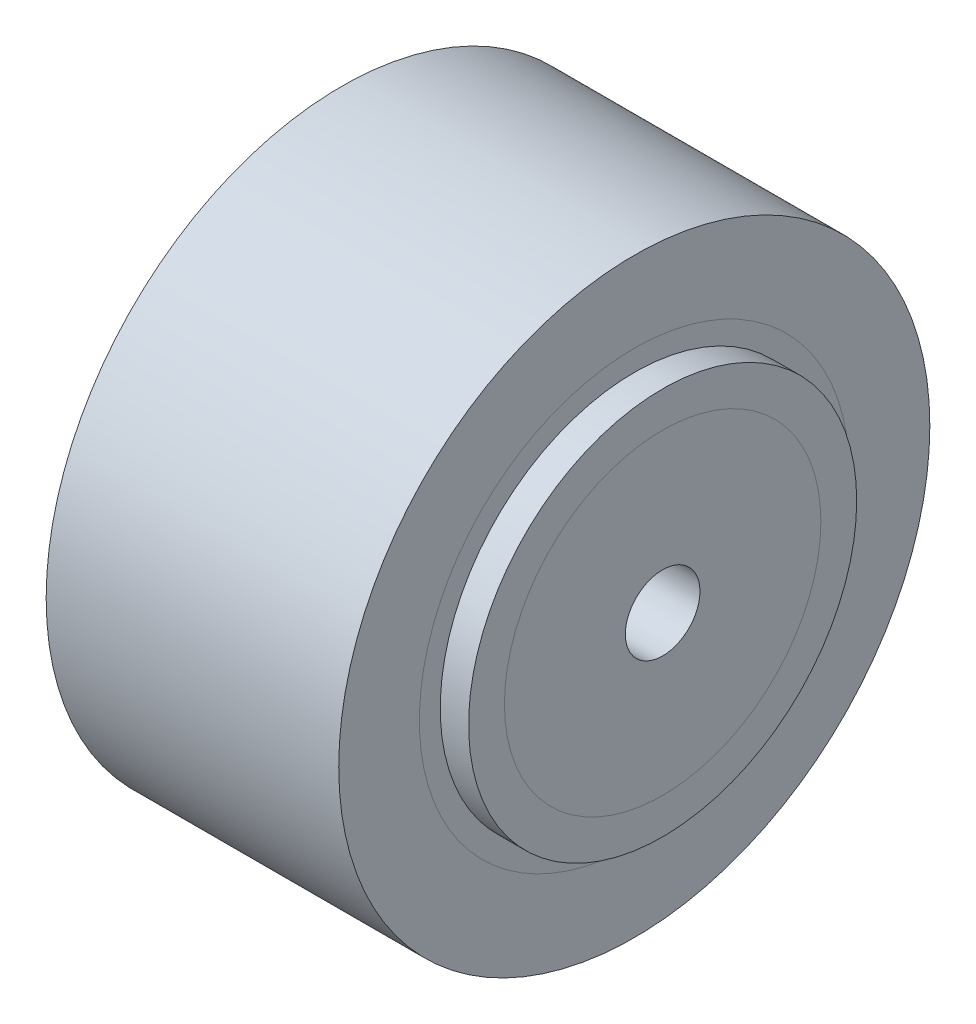
ISO-10303-21;
HEADER;
FILE_DESCRIPTION(('STEP AP214'),'2;1');
FILE_NAME('part.step','',(''),(''),'','','');
FILE_SCHEMA(('AUTOMOTIVE_DESIGN { 1 0 10303 214 1 1 1 1 }'));
ENDSEC;
DATA;
#1=APPLICATION_CONTEXT('core data for automotive mechanical design processes');
#2=APPLICATION_PROTOCOL_DEFINITION('international standard','automotive_design',2000,#1);
#3=PRODUCT_CONTEXT('',#1,'mechanical');
#4=PRODUCT('Part','Part','',(#3));
#5=PRODUCT_RELATED_PRODUCT_CATEGORY('part','',(#4));
#6=PRODUCT_DEFINITION_FORMATION('','',#4);
#7=PRODUCT_DEFINITION_CONTEXT('part definition',#1,'design');
#8=PRODUCT_DEFINITION('design','',#6,#7);
#9=PRODUCT_DEFINITION_SHAPE('','',#8);
#10=(LENGTH_UNIT() NAMED_UNIT(*) SI_UNIT(.MILLI.,.METRE.));
#11=(NAMED_UNIT(*) PLANE_ANGLE_UNIT() SI_UNIT($,.RADIAN.));
#12=(NAMED_UNIT(*) SI_UNIT($,.STERADIAN.) SOLID_ANGLE_UNIT());
#13=UNCERTAINTY_MEASURE_WITH_UNIT(LENGTH_MEASURE(1.E-05),#10,'distance_accuracy_value','');
#14=(GEOMETRIC_REPRESENTATION_CONTEXT(3) GLOBAL_UNCERTAINTY_ASSIGNED_CONTEXT((#13)) GLOBAL_UNIT_ASSIGNED_CONTEXT((#10,
#11,#12)) REPRESENTATION_CONTEXT('',''));
#15=CARTESIAN_POINT('',(0.,0.,0.));
#16=DIRECTION('',(0.,0.,1.));
#17=DIRECTION('',(1.,0.,0.));
#18=AXIS2_PLACEMENT_3D('',#15,#16,#17);
#19=CARTESIAN_POINT('',(-11.7,0.,0.));
#20=DIRECTION('',(1.,0.,0.));
#21=DIRECTION('',(0.,0.,-1.));
#22=AXIS2_PLACEMENT_3D('',#19,#20,#21);
#23=CYLINDRICAL_SURFACE('',#22,10.6);
#24=CARTESIAN_POINT('',(-11.7,0.,0.));
#25=DIRECTION('',(-1.,0.,0.));
#26=DIRECTION('',(0.,0.,1.));
#27=AXIS2_PLACEMENT_3D('',#24,#25,#26);
#28=CIRCLE('',#27,10.6);
#29=CARTESIAN_POINT('',(-11.7,0.,10.6));
#30=VERTEX_POINT('',#29);
#31=EDGE_CURVE('E53',#30,#30,#28,.T.);
#32=ORIENTED_EDGE('',*,*,#31,.F.);
#33=EDGE_LOOP('',(#32));
#34=FACE_BOUND('',#33,.T.);
#35=CARTESIAN_POINT('',(0.,0.,0.));
#36=DIRECTION('',(-1.,0.,0.));
#37=DIRECTION('',(0.,0.,1.));
#38=AXIS2_PLACEMENT_3D('',#35,#36,#37);
#39=CIRCLE('',#38,10.6);
#40=CARTESIAN_POINT('',(0.,0.,10.6));
#41=VERTEX_POINT('',#40);
#42=EDGE_CURVE('E59',#41,#41,#39,.T.);
#43=ORIENTED_EDGE('',*,*,#42,.T.);
#44=EDGE_LOOP('',(#43));
#45=FACE_BOUND('',#44,.T.);
#46=ADVANCED_FACE('F46',(#34,#45),#23,.T.);
#47=CARTESIAN_POINT('',(-11.7,0.,0.));
#48=DIRECTION('',(1.,0.,0.));
#49=DIRECTION('',(0.,0.,-1.));
#50=AXIS2_PLACEMENT_3D('',#47,#48,#49);
#51=CYLINDRICAL_SURFACE('',#50,2.5);
#52=CARTESIAN_POINT('',(-11.7,0.,0.));
#53=DIRECTION('',(-1.,0.,0.));
#54=DIRECTION('',(0.,0.,1.));
#55=AXIS2_PLACEMENT_3D('',#52,#53,#54);
#56=CIRCLE('',#55,2.5);
#57=CARTESIAN_POINT('',(-11.7,0.,2.5));
#58=VERTEX_POINT('',#57);
#59=EDGE_CURVE('E11',#58,#58,#56,.F.);
#60=ORIENTED_EDGE('',*,*,#59,.F.);
#61=EDGE_LOOP('',(#60));
#62=FACE_BOUND('',#61,.T.);
#63=CARTESIAN_POINT('',(0.,0.,0.));
#64=DIRECTION('',(-1.,0.,0.));
#65=DIRECTION('',(0.,0.,1.));
#66=AXIS2_PLACEMENT_3D('',#63,#64,#65);
#67=CIRCLE('',#66,2.5);
#68=CARTESIAN_POINT('',(0.,0.,2.5));
#69=VERTEX_POINT('',#68);
#70=EDGE_CURVE('E49',#69,#69,#67,.F.);
#71=ORIENTED_EDGE('',*,*,#70,.T.);
#72=EDGE_LOOP('',(#71));
#73=FACE_BOUND('',#72,.T.);
#74=ADVANCED_FACE('F66',(#62,#73),#51,.F.);
#75=CARTESIAN_POINT('',(-11.7,0.,0.));
#76=DIRECTION('',(-1.,0.,0.));
#77=DIRECTION('',(0.,0.,1.));
#78=AXIS2_PLACEMENT_3D('',#75,#76,#77);
#79=PLANE('',#78);
#80=ORIENTED_EDGE('',*,*,#31,.T.);
#81=EDGE_LOOP('',(#80));
#82=FACE_BOUND('',#81,.T.);
#83=ORIENTED_EDGE('',*,*,#59,.T.);
#84=EDGE_LOOP('',(#83));
#85=FACE_BOUND('',#84,.T.);
#86=ADVANCED_FACE('F70',(#82,#85),#79,.T.);
#87=CARTESIAN_POINT('',(0.,0.,0.));
#88=DIRECTION('',(-1.,0.,0.));
#89=DIRECTION('',(0.,0.,1.));
#90=AXIS2_PLACEMENT_3D('',#87,#88,#89);
#91=PLANE('',#90);
#92=ORIENTED_EDGE('',*,*,#42,.F.);
#93=EDGE_LOOP('',(#92));
#94=FACE_BOUND('',#93,.T.);
#95=ORIENTED_EDGE('',*,*,#70,.F.);
#96=EDGE_LOOP('',(#95));
#97=FACE_BOUND('',#96,.T.);
#98=ADVANCED_FACE('F68',(#94,#97),#91,.F.);
#99=CLOSED_SHELL('',(#46,#74,#86,#98));
#100=MANIFOLD_SOLID_BREP('B2',#99);
#101=CARTESIAN_POINT('',(-11.7,0.,0.));
#102=DIRECTION('',(1.,0.,0.));
#103=DIRECTION('',(0.,0.,-1.));
#104=AXIS2_PLACEMENT_3D('',#101,#102,#103);
#105=CYLINDRICAL_SURFACE('',#104,13.);
#106=CARTESIAN_POINT('',(-11.7,0.,0.));
#107=DIRECTION('',(-1.,0.,0.));
#108=DIRECTION('',(0.,0.,1.));
#109=AXIS2_PLACEMENT_3D('',#106,#107,#108);
#110=CIRCLE('',#109,13.);
#111=CARTESIAN_POINT('',(-11.7,0.,13.));
#112=VERTEX_POINT('',#111);
#113=EDGE_CURVE('E126',#112,#112,#110,.T.);
#114=ORIENTED_EDGE('',*,*,#113,.F.);
#115=EDGE_LOOP('',(#114));
#116=FACE_BOUND('',#115,.T.);
#117=CARTESIAN_POINT('',(0.,0.,0.));
#118=DIRECTION('',(-1.,0.,0.));
#119=DIRECTION('',(0.,0.,1.));
#120=AXIS2_PLACEMENT_3D('',#117,#118,#119);
#121=CIRCLE('',#120,13.);
#122=CARTESIAN_POINT('',(0.,0.,13.));
#123=VERTEX_POINT('',#122);
#124=EDGE_CURVE('E132',#123,#123,#121,.T.);
#125=ORIENTED_EDGE('',*,*,#124,.T.);
#126=EDGE_LOOP('',(#125));
#127=FACE_BOUND('',#126,.T.);
#128=ADVANCED_FACE('F119',(#116,#127),#105,.T.);
#129=CARTESIAN_POINT('',(-11.7,0.,0.));
#130=DIRECTION('',(1.,0.,0.));
#131=DIRECTION('',(0.,0.,-1.));
#132=AXIS2_PLACEMENT_3D('',#129,#130,#131);
#133=CYLINDRICAL_SURFACE('',#132,10.6);
#134=CARTESIAN_POINT('',(-11.7,0.,0.));
#135=DIRECTION('',(-1.,0.,0.));
#136=DIRECTION('',(0.,0.,1.));
#137=AXIS2_PLACEMENT_3D('',#134,#135,#136);
#138=CIRCLE('',#137,10.6);
#139=CARTESIAN_POINT('',(-11.7,0.,10.6));
#140=VERTEX_POINT('',#139);
#141=EDGE_CURVE('E45',#140,#140,#138,.F.);
#142=ORIENTED_EDGE('',*,*,#141,.F.);
#143=EDGE_LOOP('',(#142));
#144=FACE_BOUND('',#143,.T.);
#145=CARTESIAN_POINT('',(0.,0.,0.));
#146=DIRECTION('',(-1.,0.,0.));
#147=DIRECTION('',(0.,0.,1.));
#148=AXIS2_PLACEMENT_3D('',#145,#146,#147);
#149=CIRCLE('',#148,10.6);
#150=CARTESIAN_POINT('',(0.,0.,10.6));
#151=VERTEX_POINT('',#150);
#152=EDGE_CURVE('E122',#151,#151,#149,.F.);
#153=ORIENTED_EDGE('',*,*,#152,.T.);
#154=EDGE_LOOP('',(#153));
#155=FACE_BOUND('',#154,.T.);
#156=ADVANCED_FACE('F139',(#144,#155),#133,.F.);
#157=CARTESIAN_POINT('',(-11.7,0.,0.));
#158=DIRECTION('',(-1.,0.,0.));
#159=DIRECTION('',(0.,0.,1.));
#160=AXIS2_PLACEMENT_3D('',#157,#158,#159);
#161=PLANE('',#160);
#162=ORIENTED_EDGE('',*,*,#113,.T.);
#163=EDGE_LOOP('',(#162));
#164=FACE_BOUND('',#163,.T.);
#165=ORIENTED_EDGE('',*,*,#141,.T.);
#166=EDGE_LOOP('',(#165));
#167=FACE_BOUND('',#166,.T.);
#168=ADVANCED_FACE('F143',(#164,#167),#161,.T.);
#169=CARTESIAN_POINT('',(0.,0.,0.));
#170=DIRECTION('',(-1.,0.,0.));
#171=DIRECTION('',(0.,0.,1.));
#172=AXIS2_PLACEMENT_3D('',#169,#170,#171);
#173=PLANE('',#172);
#174=ORIENTED_EDGE('',*,*,#124,.F.);
#175=EDGE_LOOP('',(#174));
#176=FACE_BOUND('',#175,.T.);
#177=ORIENTED_EDGE('',*,*,#152,.F.);
#178=EDGE_LOOP('',(#177));
#179=FACE_BOUND('',#178,.T.);
#180=ADVANCED_FACE('F141',(#176,#179),#173,.F.);
#181=CLOSED_SHELL('',(#128,#156,#168,#180));
#182=MANIFOLD_SOLID_BREP('B6',#181);
#183=CARTESIAN_POINT('',(-50.5293505963451,0.,0.));
#184=DIRECTION('',(1.,0.,0.));
#185=DIRECTION('',(0.,0.,-1.));
#186=AXIS2_PLACEMENT_3D('',#183,#184,#185);
#187=CYLINDRICAL_SURFACE('',#186,14.4);
#188=CARTESIAN_POINT('',(0.,0.,0.));
#189=DIRECTION('',(-1.,0.,0.));
#190=DIRECTION('',(0.,0.,1.));
#191=AXIS2_PLACEMENT_3D('',#188,#189,#190);
#192=CIRCLE('',#191,14.4);
#193=CARTESIAN_POINT('',(0.,0.,-14.4));
#194=VERTEX_POINT('',#193);
#195=EDGE_CURVE('E205',#194,#194,#192,.T.);
#196=CARTESIAN_POINT('',(-9.8,0.,0.));
#197=DIRECTION('',(-1.,0.,0.));
#198=DIRECTION('',(0.,0.,1.));
#199=AXIS2_PLACEMENT_3D('',#196,#197,#198);
#200=CIRCLE('',#199,14.4);
#201=CARTESIAN_POINT('',(-9.8,0.,-14.4));
#202=VERTEX_POINT('',#201);
#203=EDGE_CURVE('E118',#202,#202,#200,.T.);
#204=CARTESIAN_POINT('',(0.,0.,-14.4));
#205=CARTESIAN_POINT('',(-0.102083333333327,0.,-14.4));
#206=CARTESIAN_POINT('',(-0.20416666666666,0.,-14.4));
#207=CARTESIAN_POINT('',(-0.408333333333328,0.,-14.4));
#208=CARTESIAN_POINT('',(-0.510416666666661,0.,-14.4));
#209=CARTESIAN_POINT('',(-0.714583333333329,0.,-14.4));
#210=CARTESIAN_POINT('',(-0.816666666666662,0.,-14.4));
#211=CARTESIAN_POINT('',(-1.02083333333333,0.,-14.4));
#212=CARTESIAN_POINT('',(-1.12291666666666,0.,-14.4));
#213=CARTESIAN_POINT('',(-1.32708333333333,0.,-14.4));
#214=CARTESIAN_POINT('',(-1.42916666666666,0.,-14.4));
#215=CARTESIAN_POINT('',(-1.63333333333332,0.,-14.4));
#216=CARTESIAN_POINT('',(-1.73541666666666,0.,-14.4));
#217=CARTESIAN_POINT('',(-1.93958333333333,0.,-14.4));
#218=CARTESIAN_POINT('',(-2.04166666666666,0.,-14.4));
#219=CARTESIAN_POINT('',(-2.24583333333333,0.,-14.4));
#220=CARTESIAN_POINT('',(-2.34791666666666,0.,-14.4));
#221=CARTESIAN_POINT('',(-2.55208333333333,0.,-14.4));
#222=CARTESIAN_POINT('',(-2.65416666666666,0.,-14.4));
#223=CARTESIAN_POINT('',(-2.85833333333333,0.,-14.4));
#224=CARTESIAN_POINT('',(-2.96041666666666,0.,-14.4));
#225=CARTESIAN_POINT('',(-3.16458333333333,0.,-14.4));
#226=CARTESIAN_POINT('',(-3.26666666666666,0.,-14.4));
#227=CARTESIAN_POINT('',(-3.47083333333333,0.,-14.4));
#228=CARTESIAN_POINT('',(-3.57291666666666,0.,-14.4));
#229=CARTESIAN_POINT('',(-3.77708333333332,0.,-14.4));
#230=CARTESIAN_POINT('',(-3.87916666666666,0.,-14.4));
#231=CARTESIAN_POINT('',(-4.08333333333333,0.,-14.4));
#232=CARTESIAN_POINT('',(-4.18541666666666,0.,-14.4));
#233=CARTESIAN_POINT('',(-4.38958333333333,0.,-14.4));
#234=CARTESIAN_POINT('',(-4.49166666666666,0.,-14.4));
#235=CARTESIAN_POINT('',(-4.69583333333333,0.,-14.4));
#236=CARTESIAN_POINT('',(-4.79791666666666,0.,-14.4));
#237=CARTESIAN_POINT('',(-5.00208333333333,0.,-14.4));
#238=CARTESIAN_POINT('',(-5.10416666666666,0.,-14.4));
#239=CARTESIAN_POINT('',(-5.30833333333333,0.,-14.4));
#240=CARTESIAN_POINT('',(-5.41041666666666,0.,-14.4));
#241=CARTESIAN_POINT('',(-5.61458333333333,0.,-14.4));
#242=CARTESIAN_POINT('',(-5.71666666666666,0.,-14.4));
#243=CARTESIAN_POINT('',(-5.92083333333333,0.,-14.4));
#244=CARTESIAN_POINT('',(-6.02291666666667,0.,-14.4));
#245=CARTESIAN_POINT('',(-6.22708333333333,0.,-14.4));
#246=CARTESIAN_POINT('',(-6.32916666666666,0.,-14.4));
#247=CARTESIAN_POINT('',(-6.53333333333333,0.,-14.4));
#248=CARTESIAN_POINT('',(-6.63541666666666,0.,-14.4));
#249=CARTESIAN_POINT('',(-6.83958333333333,0.,-14.4));
#250=CARTESIAN_POINT('',(-6.94166666666666,0.,-14.4));
#251=CARTESIAN_POINT('',(-7.14583333333333,0.,-14.4));
#252=CARTESIAN_POINT('',(-7.24791666666666,0.,-14.4));
#253=CARTESIAN_POINT('',(-7.45208333333333,0.,-14.4));
#254=CARTESIAN_POINT('',(-7.55416666666666,0.,-14.4));
#255=CARTESIAN_POINT('',(-7.75833333333333,0.,-14.4));
#256=CARTESIAN_POINT('',(-7.86041666666666,0.,-14.4));
#257=CARTESIAN_POINT('',(-8.06458333333333,0.,-14.4));
#258=CARTESIAN_POINT('',(-8.16666666666666,0.,-14.4));
#259=CARTESIAN_POINT('',(-8.37083333333333,0.,-14.4));
#260=CARTESIAN_POINT('',(-8.47291666666666,0.,-14.4));
#261=CARTESIAN_POINT('',(-8.67708333333333,0.,-14.4));
#262=CARTESIAN_POINT('',(-8.77916666666667,0.,-14.4));
#263=CARTESIAN_POINT('',(-8.98333333333333,0.,-14.4));
#264=CARTESIAN_POINT('',(-9.08541666666666,0.,-14.4));
#265=CARTESIAN_POINT('',(-9.28958333333333,0.,-14.4));
#266=CARTESIAN_POINT('',(-9.39166666666666,0.,-14.4));
#267=CARTESIAN_POINT('',(-9.59583333333333,0.,-14.4));
#268=CARTESIAN_POINT('',(-9.69791666666666,0.,-14.4));
#269=CARTESIAN_POINT('',(-9.8,0.,-14.4));
#270=B_SPLINE_CURVE_WITH_KNOTS('',3,(#204,#205,#206,#207,#208,#209,#210,#211,#212,#213,#214,
#215,#216,#217,#218,#219,#220,#221,#222,#223,#224,#225,#226,#227,#228,#229,#230,#231,#232,#233,
#234,#235,#236,#237,#238,#239,#240,#241,#242,#243,#244,#245,#246,#247,#248,#249,#250,#251,#252,
#253,#254,#255,#256,#257,#258,#259,#260,#261,#262,#263,#264,#265,#266,#267,#268,#269),
.UNSPECIFIED.,.F.,.F.,(4,2,2,2,2,2,2,2,2,2,2,2,2,2,2,2,2,2,2,2,2,2,2,2,2,2,2,2,2,2,2,2,4),(0.,
0.306250000000001,0.612500000000002,0.918750000000003,1.225,1.53125,1.8375,2.14375,2.45,2.75625,
3.0625,3.36875,3.675,3.98125,4.2875,4.59375,4.9,5.20625,5.5125,5.81875,6.12500000000001,6.43125,
6.7375,7.04375,7.35,7.65625,7.9625,8.26875000000001,8.575,8.88125000000001,9.1875,9.49375,9.8),.UNSPECIFIED.);
#271=EDGE_CURVE('BSEAM192',#194,#202,#270,.T.);
#272=ORIENTED_EDGE('',*,*,#195,.T.);
#273=ORIENTED_EDGE('',*,*,#203,.F.);
#274=ORIENTED_EDGE('',*,*,#271,.T.);
#275=ORIENTED_EDGE('',*,*,#271,.F.);
#276=EDGE_LOOP('',(#272,#274,#273,#275));
#277=FACE_BOUND('',#276,.T.);
#278=ADVANCED_FACE('F192',(#277),#187,.T.);
#279=CARTESIAN_POINT('',(-50.5293505963451,0.,0.));
#280=DIRECTION('',(1.,0.,0.));
#281=DIRECTION('',(0.,0.,-1.));
#282=AXIS2_PLACEMENT_3D('',#279,#280,#281);
#283=CYLINDRICAL_SURFACE('',#282,13.);
#284=CARTESIAN_POINT('',(0.,0.,0.));
#285=DIRECTION('',(-1.,0.,0.));
#286=DIRECTION('',(0.,0.,1.));
#287=AXIS2_PLACEMENT_3D('',#284,#285,#286);
#288=CIRCLE('',#287,13.);
#289=CARTESIAN_POINT('',(0.,0.,-13.));
#290=VERTEX_POINT('',#289);
#291=EDGE_CURVE('E203',#290,#290,#288,.F.);
#292=CARTESIAN_POINT('',(-9.8,0.,0.));
#293=DIRECTION('',(-1.,0.,0.));
#294=DIRECTION('',(0.,0.,1.));
#295=AXIS2_PLACEMENT_3D('',#292,#293,#294);
#296=CIRCLE('',#295,13.);
#297=CARTESIAN_POINT('',(-9.8,0.,-13.));
#298=VERTEX_POINT('',#297);
#299=EDGE_CURVE('E196',#298,#298,#296,.F.);
#300=CARTESIAN_POINT('',(0.,0.,-13.));
#301=CARTESIAN_POINT('',(-0.102083333333327,0.,-13.));
#302=CARTESIAN_POINT('',(-0.20416666666666,0.,-13.));
#303=CARTESIAN_POINT('',(-0.408333333333328,0.,-13.));
#304=CARTESIAN_POINT('',(-0.510416666666661,0.,-13.));
#305=CARTESIAN_POINT('',(-0.714583333333329,0.,-13.));
#306=CARTESIAN_POINT('',(-0.816666666666662,0.,-13.));
#307=CARTESIAN_POINT('',(-1.02083333333333,0.,-13.));
#308=CARTESIAN_POINT('',(-1.12291666666666,0.,-13.));
#309=CARTESIAN_POINT('',(-1.32708333333333,0.,-13.));
#310=CARTESIAN_POINT('',(-1.42916666666666,0.,-13.));
#311=CARTESIAN_POINT('',(-1.63333333333332,0.,-13.));
#312=CARTESIAN_POINT('',(-1.73541666666666,0.,-13.));
#313=CARTESIAN_POINT('',(-1.93958333333333,0.,-13.));
#314=CARTESIAN_POINT('',(-2.04166666666666,0.,-13.));
#315=CARTESIAN_POINT('',(-2.24583333333333,0.,-13.));
#316=CARTESIAN_POINT('',(-2.34791666666666,0.,-13.));
#317=CARTESIAN_POINT('',(-2.55208333333333,0.,-13.));
#318=CARTESIAN_POINT('',(-2.65416666666666,0.,-13.));
#319=CARTESIAN_POINT('',(-2.85833333333333,0.,-13.));
#320=CARTESIAN_POINT('',(-2.96041666666666,0.,-13.));
#321=CARTESIAN_POINT('',(-3.16458333333333,0.,-13.));
#322=CARTESIAN_POINT('',(-3.26666666666666,0.,-13.));
#323=CARTESIAN_POINT('',(-3.47083333333333,0.,-13.));
#324=CARTESIAN_POINT('',(-3.57291666666666,0.,-13.));
#325=CARTESIAN_POINT('',(-3.77708333333332,0.,-13.));
#326=CARTESIAN_POINT('',(-3.87916666666666,0.,-13.));
#327=CARTESIAN_POINT('',(-4.08333333333333,0.,-13.));
#328=CARTESIAN_POINT('',(-4.18541666666666,0.,-13.));
#329=CARTESIAN_POINT('',(-4.38958333333333,0.,-13.));
#330=CARTESIAN_POINT('',(-4.49166666666666,0.,-13.));
#331=CARTESIAN_POINT('',(-4.69583333333333,0.,-13.));
#332=CARTESIAN_POINT('',(-4.79791666666666,0.,-13.));
#333=CARTESIAN_POINT('',(-5.00208333333333,0.,-13.));
#334=CARTESIAN_POINT('',(-5.10416666666666,0.,-13.));
#335=CARTESIAN_POINT('',(-5.30833333333333,0.,-13.));
#336=CARTESIAN_POINT('',(-5.41041666666666,0.,-13.));
#337=CARTESIAN_POINT('',(-5.61458333333333,0.,-13.));
#338=CARTESIAN_POINT('',(-5.71666666666666,0.,-13.));
#339=CARTESIAN_POINT('',(-5.92083333333333,0.,-13.));
#340=CARTESIAN_POINT('',(-6.02291666666667,0.,-13.));
#341=CARTESIAN_POINT('',(-6.22708333333333,0.,-13.));
#342=CARTESIAN_POINT('',(-6.32916666666666,0.,-13.));
#343=CARTESIAN_POINT('',(-6.53333333333333,0.,-13.));
#344=CARTESIAN_POINT('',(-6.63541666666666,0.,-13.));
#345=CARTESIAN_POINT('',(-6.83958333333333,0.,-13.));
#346=CARTESIAN_POINT('',(-6.94166666666666,0.,-13.));
#347=CARTESIAN_POINT('',(-7.14583333333333,0.,-13.));
#348=CARTESIAN_POINT('',(-7.24791666666666,0.,-13.));
#349=CARTESIAN_POINT('',(-7.45208333333333,0.,-13.));
#350=CARTESIAN_POINT('',(-7.55416666666666,0.,-13.));
#351=CARTESIAN_POINT('',(-7.75833333333333,0.,-13.));
#352=CARTESIAN_POINT('',(-7.86041666666666,0.,-13.));
#353=CARTESIAN_POINT('',(-8.06458333333333,0.,-13.));
#354=CARTESIAN_POINT('',(-8.16666666666666,0.,-13.));
#355=CARTESIAN_POINT('',(-8.37083333333333,0.,-13.));
#356=CARTESIAN_POINT('',(-8.47291666666666,0.,-13.));
#357=CARTESIAN_POINT('',(-8.67708333333333,0.,-13.));
#358=CARTESIAN_POINT('',(-8.77916666666667,0.,-13.));
#359=CARTESIAN_POINT('',(-8.98333333333333,0.,-13.));
#360=CARTESIAN_POINT('',(-9.08541666666666,0.,-13.));
#361=CARTESIAN_POINT('',(-9.28958333333333,0.,-13.));
#362=CARTESIAN_POINT('',(-9.39166666666666,0.,-13.));
#363=CARTESIAN_POINT('',(-9.59583333333333,0.,-13.));
#364=CARTESIAN_POINT('',(-9.69791666666666,0.,-13.));
#365=CARTESIAN_POINT('',(-9.8,0.,-13.));
#366=B_SPLINE_CURVE_WITH_KNOTS('',3,(#300,#301,#302,#303,#304,#305,#306,#307,#308,#309,#310,
#311,#312,#313,#314,#315,#316,#317,#318,#319,#320,#321,#322,#323,#324,#325,#326,#327,#328,#329,
#330,#331,#332,#333,#334,#335,#336,#337,#338,#339,#340,#341,#342,#343,#344,#345,#346,#347,#348,
#349,#350,#351,#352,#353,#354,#355,#356,#357,#358,#359,#360,#361,#362,#363,#364,#365),
.UNSPECIFIED.,.F.,.F.,(4,2,2,2,2,2,2,2,2,2,2,2,2,2,2,2,2,2,2,2,2,2,2,2,2,2,2,2,2,2,2,2,4),(0.,
0.306250000000001,0.612500000000002,0.918750000000003,1.225,1.53125,1.8375,2.14375,2.45,2.75625,
3.0625,3.36875,3.675,3.98125,4.2875,4.59375,4.9,5.20625,5.5125,5.81875,6.12500000000001,6.43125,
6.7375,7.04375,7.35,7.65625,7.9625,8.26875000000001,8.575,8.88125000000001,9.1875,9.49375,9.8),.UNSPECIFIED.);
#367=EDGE_CURVE('BSEAM211',#290,#298,#366,.T.);
#368=ORIENTED_EDGE('',*,*,#291,.T.);
#369=ORIENTED_EDGE('',*,*,#299,.F.);
#370=ORIENTED_EDGE('',*,*,#367,.T.);
#371=ORIENTED_EDGE('',*,*,#367,.F.);
#372=EDGE_LOOP('',(#368,#370,#369,#371));
#373=FACE_BOUND('',#372,.T.);
#374=ADVANCED_FACE('F211',(#373),#283,.F.);
#375=CARTESIAN_POINT('',(0.,0.,0.));
#376=DIRECTION('',(-1.,0.,0.));
#377=DIRECTION('',(0.,0.,1.));
#378=AXIS2_PLACEMENT_3D('',#375,#376,#377);
#379=PLANE('',#378);
#380=ORIENTED_EDGE('',*,*,#195,.F.);
#381=EDGE_LOOP('',(#380));
#382=FACE_BOUND('',#381,.T.);
#383=ORIENTED_EDGE('',*,*,#291,.F.);
#384=EDGE_LOOP('',(#383));
#385=FACE_BOUND('',#384,.T.);
#386=ADVANCED_FACE('F214',(#382,#385),#379,.F.);
#387=CARTESIAN_POINT('',(-9.8,0.,0.));
#388=DIRECTION('',(-1.,0.,0.));
#389=DIRECTION('',(0.,0.,-1.));
#390=AXIS2_PLACEMENT_3D('',#387,#388,#389);
#391=PLANE('',#390);
#392=ORIENTED_EDGE('',*,*,#299,.T.);
#393=EDGE_LOOP('',(#392));
#394=FACE_BOUND('',#393,.T.);
#395=ORIENTED_EDGE('',*,*,#203,.T.);
#396=EDGE_LOOP('',(#395));
#397=FACE_BOUND('',#396,.T.);
#398=ADVANCED_FACE('F194',(#394,#397),#391,.T.);
#399=CLOSED_SHELL('',(#278,#374,#386,#398));
#400=MANIFOLD_SOLID_BREP('B40',#399);
#401=CARTESIAN_POINT('',(11.7,0.,0.));
#402=DIRECTION('',(-1.,0.,0.));
#403=DIRECTION('',(0.,0.,1.));
#404=AXIS2_PLACEMENT_3D('',#401,#402,#403);
#405=CYLINDRICAL_SURFACE('',#404,2.5);
#406=CARTESIAN_POINT('',(11.7,0.,0.));
#407=DIRECTION('',(1.,0.,0.));
#408=DIRECTION('',(0.,0.,-1.));
#409=AXIS2_PLACEMENT_3D('',#406,#407,#408);
#410=CIRCLE('',#409,2.5);
#411=CARTESIAN_POINT('',(11.7,0.,-2.5));
#412=VERTEX_POINT('',#411);
#413=EDGE_CURVE('E272',#412,#412,#410,.T.);
#414=ORIENTED_EDGE('',*,*,#413,.T.);
#415=EDGE_LOOP('',(#414));
#416=FACE_BOUND('',#415,.T.);
#417=CARTESIAN_POINT('',(0.,0.,0.));
#418=DIRECTION('',(1.,0.,0.));
#419=DIRECTION('',(0.,0.,-1.));
#420=AXIS2_PLACEMENT_3D('',#417,#418,#419);
#421=CIRCLE('',#420,2.5);
#422=CARTESIAN_POINT('',(0.,0.,-2.5));
#423=VERTEX_POINT('',#422);
#424=EDGE_CURVE('E278',#423,#423,#421,.T.);
#425=ORIENTED_EDGE('',*,*,#424,.F.);
#426=EDGE_LOOP('',(#425));
#427=FACE_BOUND('',#426,.T.);
#428=ADVANCED_FACE('F265',(#416,#427),#405,.F.);
#429=CARTESIAN_POINT('',(11.7,0.,0.));
#430=DIRECTION('',(-1.,0.,0.));
#431=DIRECTION('',(0.,0.,1.));
#432=AXIS2_PLACEMENT_3D('',#429,#430,#431);
#433=CYLINDRICAL_SURFACE('',#432,10.6);
#434=CARTESIAN_POINT('',(11.7,0.,0.));
#435=DIRECTION('',(1.,0.,0.));
#436=DIRECTION('',(0.,0.,-1.));
#437=AXIS2_PLACEMENT_3D('',#434,#435,#436);
#438=CIRCLE('',#437,10.6);
#439=CARTESIAN_POINT('',(11.7,0.,-10.6));
#440=VERTEX_POINT('',#439);
#441=EDGE_CURVE('E191',#440,#440,#438,.T.);
#442=ORIENTED_EDGE('',*,*,#441,.F.);
#443=EDGE_LOOP('',(#442));
#444=FACE_BOUND('',#443,.T.);
#445=CARTESIAN_POINT('',(0.,0.,0.));
#446=DIRECTION('',(1.,0.,0.));
#447=DIRECTION('',(0.,0.,-1.));
#448=AXIS2_PLACEMENT_3D('',#445,#446,#447);
#449=CIRCLE('',#448,10.6);
#450=CARTESIAN_POINT('',(0.,0.,-10.6));
#451=VERTEX_POINT('',#450);
#452=EDGE_CURVE('E268',#451,#451,#449,.T.);
#453=ORIENTED_EDGE('',*,*,#452,.T.);
#454=EDGE_LOOP('',(#453));
#455=FACE_BOUND('',#454,.T.);
#456=ADVANCED_FACE('F285',(#444,#455),#433,.T.);
#457=CARTESIAN_POINT('',(11.7,0.,0.));
#458=DIRECTION('',(1.,0.,0.));
#459=DIRECTION('',(0.,0.,-1.));
#460=AXIS2_PLACEMENT_3D('',#457,#458,#459);
#461=PLANE('',#460);
#462=ORIENTED_EDGE('',*,*,#413,.F.);
#463=EDGE_LOOP('',(#462));
#464=FACE_BOUND('',#463,.T.);
#465=ORIENTED_EDGE('',*,*,#441,.T.);
#466=EDGE_LOOP('',(#465));
#467=FACE_BOUND('',#466,.T.);
#468=ADVANCED_FACE('F289',(#464,#467),#461,.T.);
#469=CARTESIAN_POINT('',(0.,0.,0.));
#470=DIRECTION('',(1.,0.,0.));
#471=DIRECTION('',(0.,0.,-1.));
#472=AXIS2_PLACEMENT_3D('',#469,#470,#471);
#473=PLANE('',#472);
#474=ORIENTED_EDGE('',*,*,#424,.T.);
#475=EDGE_LOOP('',(#474));
#476=FACE_BOUND('',#475,.T.);
#477=ORIENTED_EDGE('',*,*,#452,.F.);
#478=EDGE_LOOP('',(#477));
#479=FACE_BOUND('',#478,.T.);
#480=ADVANCED_FACE('F287',(#476,#479),#473,.F.);
#481=CLOSED_SHELL('',(#428,#456,#468,#480));
#482=MANIFOLD_SOLID_BREP('B113',#481);
#483=CARTESIAN_POINT('',(11.7,0.,0.));
#484=DIRECTION('',(-1.,0.,0.));
#485=DIRECTION('',(0.,0.,1.));
#486=AXIS2_PLACEMENT_3D('',#483,#484,#485);
#487=CYLINDRICAL_SURFACE('',#486,10.6);
#488=CARTESIAN_POINT('',(11.7,0.,0.));
#489=DIRECTION('',(1.,0.,0.));
#490=DIRECTION('',(0.,0.,-1.));
#491=AXIS2_PLACEMENT_3D('',#488,#489,#490);
#492=CIRCLE('',#491,10.6);
#493=CARTESIAN_POINT('',(11.7,0.,-10.6));
#494=VERTEX_POINT('',#493);
#495=EDGE_CURVE('E342',#494,#494,#492,.T.);
#496=ORIENTED_EDGE('',*,*,#495,.T.);
#497=EDGE_LOOP('',(#496));
#498=FACE_BOUND('',#497,.T.);
#499=CARTESIAN_POINT('',(0.,0.,0.));
#500=DIRECTION('',(1.,0.,0.));
#501=DIRECTION('',(0.,0.,-1.));
#502=AXIS2_PLACEMENT_3D('',#499,#500,#501);
#503=CIRCLE('',#502,10.6);
#504=CARTESIAN_POINT('',(0.,0.,-10.6));
#505=VERTEX_POINT('',#504);
#506=EDGE_CURVE('E348',#505,#505,#503,.T.);
#507=ORIENTED_EDGE('',*,*,#506,.F.);
#508=EDGE_LOOP('',(#507));
#509=FACE_BOUND('',#508,.T.);
#510=ADVANCED_FACE('F335',(#498,#509),#487,.F.);
#511=CARTESIAN_POINT('',(11.7,0.,0.));
#512=DIRECTION('',(-1.,0.,0.));
#513=DIRECTION('',(0.,0.,1.));
#514=AXIS2_PLACEMENT_3D('',#511,#512,#513);
#515=CYLINDRICAL_SURFACE('',#514,13.);
#516=CARTESIAN_POINT('',(11.7,0.,0.));
#517=DIRECTION('',(1.,0.,0.));
#518=DIRECTION('',(0.,0.,-1.));
#519=AXIS2_PLACEMENT_3D('',#516,#517,#518);
#520=CIRCLE('',#519,13.);
#521=CARTESIAN_POINT('',(11.7,0.,-13.));
#522=VERTEX_POINT('',#521);
#523=EDGE_CURVE('E264',#522,#522,#520,.T.);
#524=ORIENTED_EDGE('',*,*,#523,.F.);
#525=EDGE_LOOP('',(#524));
#526=FACE_BOUND('',#525,.T.);
#527=CARTESIAN_POINT('',(0.,0.,0.));
#528=DIRECTION('',(1.,0.,0.));
#529=DIRECTION('',(0.,0.,-1.));
#530=AXIS2_PLACEMENT_3D('',#527,#528,#529);
#531=CIRCLE('',#530,13.);
#532=CARTESIAN_POINT('',(0.,0.,-13.));
#533=VERTEX_POINT('',#532);
#534=EDGE_CURVE('E338',#533,#533,#531,.T.);
#535=ORIENTED_EDGE('',*,*,#534,.T.);
#536=EDGE_LOOP('',(#535));
#537=FACE_BOUND('',#536,.T.);
#538=ADVANCED_FACE('F355',(#526,#537),#515,.T.);
#539=CARTESIAN_POINT('',(11.7,0.,0.));
#540=DIRECTION('',(1.,0.,0.));
#541=DIRECTION('',(0.,0.,-1.));
#542=AXIS2_PLACEMENT_3D('',#539,#540,#541);
#543=PLANE('',#542);
#544=ORIENTED_EDGE('',*,*,#495,.F.);
#545=EDGE_LOOP('',(#544));
#546=FACE_BOUND('',#545,.T.);
#547=ORIENTED_EDGE('',*,*,#523,.T.);
#548=EDGE_LOOP('',(#547));
#549=FACE_BOUND('',#548,.T.);
#550=ADVANCED_FACE('F359',(#546,#549),#543,.T.);
#551=CARTESIAN_POINT('',(0.,0.,0.));
#552=DIRECTION('',(1.,0.,0.));
#553=DIRECTION('',(0.,0.,-1.));
#554=AXIS2_PLACEMENT_3D('',#551,#552,#553);
#555=PLANE('',#554);
#556=ORIENTED_EDGE('',*,*,#506,.T.);
#557=EDGE_LOOP('',(#556));
#558=FACE_BOUND('',#557,.T.);
#559=ORIENTED_EDGE('',*,*,#534,.F.);
#560=EDGE_LOOP('',(#559));
#561=FACE_BOUND('',#560,.T.);
#562=ADVANCED_FACE('F357',(#558,#561),#555,.F.);
#563=CLOSED_SHELL('',(#510,#538,#550,#562));
#564=MANIFOLD_SOLID_BREP('B186',#563);
#565=CARTESIAN_POINT('',(9.8,0.,0.));
#566=DIRECTION('',(-1.,0.,0.));
#567=DIRECTION('',(0.,0.,1.));
#568=AXIS2_PLACEMENT_3D('',#565,#566,#567);
#569=CYLINDRICAL_SURFACE('',#568,13.);
#570=CARTESIAN_POINT('',(9.8,0.,0.));
#571=DIRECTION('',(1.,0.,0.));
#572=DIRECTION('',(0.,0.,-1.));
#573=AXIS2_PLACEMENT_3D('',#570,#571,#572);
#574=CIRCLE('',#573,13.);
#575=CARTESIAN_POINT('',(9.8,0.,-13.));
#576=VERTEX_POINT('',#575);
#577=EDGE_CURVE('E411',#576,#576,#574,.T.);
#578=ORIENTED_EDGE('',*,*,#577,.T.);
#579=EDGE_LOOP('',(#578));
#580=FACE_BOUND('',#579,.T.);
#581=CARTESIAN_POINT('',(0.,0.,0.));
#582=DIRECTION('',(1.,0.,0.));
#583=DIRECTION('',(0.,0.,-1.));
#584=AXIS2_PLACEMENT_3D('',#581,#582,#583);
#585=CIRCLE('',#584,13.);
#586=CARTESIAN_POINT('',(0.,0.,-13.));
#587=VERTEX_POINT('',#586);
#588=EDGE_CURVE('E417',#587,#587,#585,.T.);
#589=ORIENTED_EDGE('',*,*,#588,.F.);
#590=EDGE_LOOP('',(#589));
#591=FACE_BOUND('',#590,.T.);
#592=ADVANCED_FACE('F404',(#580,#591),#569,.F.);
#593=CARTESIAN_POINT('',(9.8,0.,0.));
#594=DIRECTION('',(-1.,0.,0.));
#595=DIRECTION('',(0.,0.,1.));
#596=AXIS2_PLACEMENT_3D('',#593,#594,#595);
#597=CYLINDRICAL_SURFACE('',#596,14.4);
#598=CARTESIAN_POINT('',(9.8,0.,0.));
#599=DIRECTION('',(1.,0.,0.));
#600=DIRECTION('',(0.,0.,-1.));
#601=AXIS2_PLACEMENT_3D('',#598,#599,#600);
#602=CIRCLE('',#601,14.4);
#603=CARTESIAN_POINT('',(9.8,0.,-14.4));
#604=VERTEX_POINT('',#603);
#605=EDGE_CURVE('E334',#604,#604,#602,.T.);
#606=ORIENTED_EDGE('',*,*,#605,.F.);
#607=EDGE_LOOP('',(#606));
#608=FACE_BOUND('',#607,.T.);
#609=CARTESIAN_POINT('',(0.,0.,0.));
#610=DIRECTION('',(1.,0.,0.));
#611=DIRECTION('',(0.,0.,-1.));
#612=AXIS2_PLACEMENT_3D('',#609,#610,#611);
#613=CIRCLE('',#612,14.4);
#614=CARTESIAN_POINT('',(0.,0.,-14.4));
#615=VERTEX_POINT('',#614);
#616=EDGE_CURVE('E407',#615,#615,#613,.T.);
#617=ORIENTED_EDGE('',*,*,#616,.T.);
#618=EDGE_LOOP('',(#617));
#619=FACE_BOUND('',#618,.T.);
#620=ADVANCED_FACE('F424',(#608,#619),#597,.T.);
#621=CARTESIAN_POINT('',(9.8,0.,0.));
#622=DIRECTION('',(1.,0.,0.));
#623=DIRECTION('',(0.,0.,-1.));
#624=AXIS2_PLACEMENT_3D('',#621,#622,#623);
#625=PLANE('',#624);
#626=ORIENTED_EDGE('',*,*,#577,.F.);
#627=EDGE_LOOP('',(#626));
#628=FACE_BOUND('',#627,.T.);
#629=ORIENTED_EDGE('',*,*,#605,.T.);
#630=EDGE_LOOP('',(#629));
#631=FACE_BOUND('',#630,.T.);
#632=ADVANCED_FACE('F428',(#628,#631),#625,.T.);
#633=CARTESIAN_POINT('',(0.,0.,0.));
#634=DIRECTION('',(1.,0.,0.));
#635=DIRECTION('',(0.,0.,-1.));
#636=AXIS2_PLACEMENT_3D('',#633,#634,#635);
#637=PLANE('',#636);
#638=ORIENTED_EDGE('',*,*,#588,.T.);
#639=EDGE_LOOP('',(#638));
#640=FACE_BOUND('',#639,.T.);
#641=ORIENTED_EDGE('',*,*,#616,.F.);
#642=EDGE_LOOP('',(#641));
#643=FACE_BOUND('',#642,.T.);
#644=ADVANCED_FACE('F426',(#640,#643),#637,.F.);
#645=CLOSED_SHELL('',(#592,#620,#632,#644));
#646=MANIFOLD_SOLID_BREP('B259',#645);
#647=CARTESIAN_POINT('',(9.8,0.,0.));
#648=DIRECTION('',(-1.,0.,0.));
#649=DIRECTION('',(0.,0.,1.));
#650=AXIS2_PLACEMENT_3D('',#647,#648,#649);
#651=CYLINDRICAL_SURFACE('',#650,14.4);
#652=CARTESIAN_POINT('',(9.8,0.,0.));
#653=DIRECTION('',(1.,0.,0.));
#654=DIRECTION('',(0.,0.,-1.));
#655=AXIS2_PLACEMENT_3D('',#652,#653,#654);
#656=CIRCLE('',#655,14.4);
#657=CARTESIAN_POINT('',(9.8,0.,-14.4));
#658=VERTEX_POINT('',#657);
#659=EDGE_CURVE('E472',#658,#658,#656,.T.);
#660=ORIENTED_EDGE('',*,*,#659,.T.);
#661=EDGE_LOOP('',(#660));
#662=FACE_BOUND('',#661,.T.);
#663=CARTESIAN_POINT('',(-9.8,0.,0.));
#664=DIRECTION('',(1.,0.,0.));
#665=DIRECTION('',(0.,0.,-1.));
#666=AXIS2_PLACEMENT_3D('',#663,#664,#665);
#667=CIRCLE('',#666,14.4);
#668=CARTESIAN_POINT('',(-9.8,0.,-14.4));
#669=VERTEX_POINT('',#668);
#670=EDGE_CURVE('E480',#669,#669,#667,.T.);
#671=ORIENTED_EDGE('',*,*,#670,.F.);
#672=EDGE_LOOP('',(#671));
#673=FACE_BOUND('',#672,.T.);
#674=ADVANCED_FACE('F466',(#662,#673),#651,.F.);
#675=CARTESIAN_POINT('',(9.8,0.,0.));
#676=DIRECTION('',(-1.,0.,0.));
#677=DIRECTION('',(0.,0.,1.));
#678=AXIS2_PLACEMENT_3D('',#675,#676,#677);
#679=CYLINDRICAL_SURFACE('',#678,19.8);
#680=CARTESIAN_POINT('',(9.8,0.,0.));
#681=DIRECTION('',(1.,0.,0.));
#682=DIRECTION('',(0.,0.,-1.));
#683=AXIS2_PLACEMENT_3D('',#680,#681,#682);
#684=CIRCLE('',#683,19.8);
#685=CARTESIAN_POINT('',(9.8,0.,-19.8));
#686=VERTEX_POINT('',#685);
#687=EDGE_CURVE('E403',#686,#686,#684,.T.);
#688=ORIENTED_EDGE('',*,*,#687,.F.);
#689=EDGE_LOOP('',(#688));
#690=FACE_BOUND('',#689,.T.);
#691=CARTESIAN_POINT('',(-9.8,0.,0.));
#692=DIRECTION('',(1.,0.,0.));
#693=DIRECTION('',(0.,0.,-1.));
#694=AXIS2_PLACEMENT_3D('',#691,#692,#693);
#695=CIRCLE('',#694,19.8);
#696=CARTESIAN_POINT('',(-9.8,0.,-19.8));
#697=VERTEX_POINT('',#696);
#698=EDGE_CURVE('E476',#697,#697,#695,.T.);
#699=ORIENTED_EDGE('',*,*,#698,.T.);
#700=EDGE_LOOP('',(#699));
#701=FACE_BOUND('',#700,.T.);
#702=ADVANCED_FACE('F490',(#690,#701),#679,.T.);
#703=CARTESIAN_POINT('',(9.8,0.,0.));
#704=DIRECTION('',(1.,0.,0.));
#705=DIRECTION('',(0.,0.,-1.));
#706=AXIS2_PLACEMENT_3D('',#703,#704,#705);
#707=PLANE('',#706);
#708=ORIENTED_EDGE('',*,*,#659,.F.);
#709=EDGE_LOOP('',(#708));
#710=FACE_BOUND('',#709,.T.);
#711=ORIENTED_EDGE('',*,*,#687,.T.);
#712=EDGE_LOOP('',(#711));
#713=FACE_BOUND('',#712,.T.);
#714=ADVANCED_FACE('F494',(#710,#713),#707,.T.);
#715=CARTESIAN_POINT('',(-9.8,0.,0.));
#716=DIRECTION('',(-1.,0.,0.));
#717=DIRECTION('',(0.,0.,-1.));
#718=AXIS2_PLACEMENT_3D('',#715,#716,#717);
#719=PLANE('',#718);
#720=ORIENTED_EDGE('',*,*,#670,.T.);
#721=EDGE_LOOP('',(#720));
#722=FACE_BOUND('',#721,.T.);
#723=ORIENTED_EDGE('',*,*,#698,.F.);
#724=EDGE_LOOP('',(#723));
#725=FACE_BOUND('',#724,.T.);
#726=ADVANCED_FACE('F486',(#722,#725),#719,.T.);
#727=CLOSED_SHELL('',(#674,#702,#714,#726));
#728=MANIFOLD_SOLID_BREP('B329',#727);
#729=ADVANCED_BREP_SHAPE_REPRESENTATION('',(#18,#100,#182,#400,#482,#564,#646,#728),#14);
#730=SHAPE_DEFINITION_REPRESENTATION(#9,#729);
ENDSEC;
END-ISO-10303-21;
